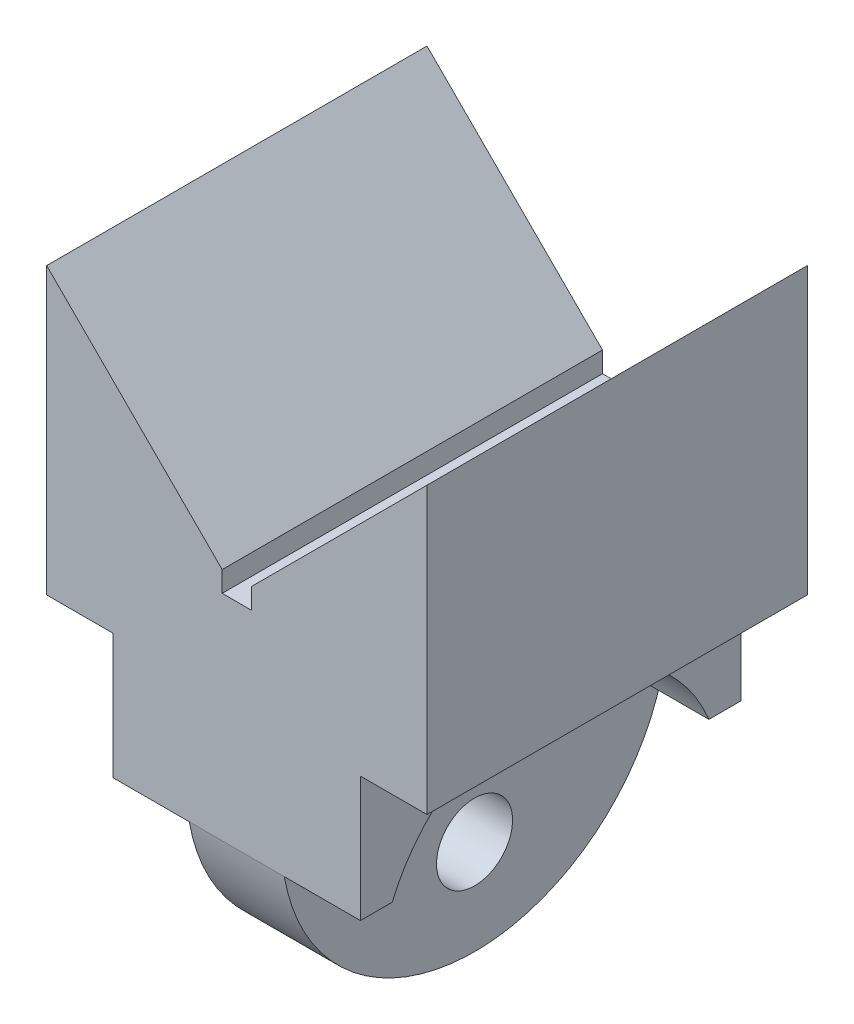
ISO-10303-21;
HEADER;
FILE_DESCRIPTION(('STEP AP214'),'2;1');
FILE_NAME('part.step','',(''),(''),'','','');
FILE_SCHEMA(('AUTOMOTIVE_DESIGN { 1 0 10303 214 1 1 1 1 }'));
ENDSEC;
DATA;
#1=APPLICATION_CONTEXT('core data for automotive mechanical design processes');
#2=APPLICATION_PROTOCOL_DEFINITION('international standard','automotive_design',2000,#1);
#3=PRODUCT_CONTEXT('',#1,'mechanical');
#4=PRODUCT('Part','Part','',(#3));
#5=PRODUCT_RELATED_PRODUCT_CATEGORY('part','',(#4));
#6=PRODUCT_DEFINITION_FORMATION('','',#4);
#7=PRODUCT_DEFINITION_CONTEXT('part definition',#1,'design');
#8=PRODUCT_DEFINITION('design','',#6,#7);
#9=PRODUCT_DEFINITION_SHAPE('','',#8);
#10=(LENGTH_UNIT() NAMED_UNIT(*) SI_UNIT(.MILLI.,.METRE.));
#11=(NAMED_UNIT(*) PLANE_ANGLE_UNIT() SI_UNIT($,.RADIAN.));
#12=(NAMED_UNIT(*) SI_UNIT($,.STERADIAN.) SOLID_ANGLE_UNIT());
#13=UNCERTAINTY_MEASURE_WITH_UNIT(LENGTH_MEASURE(1.E-05),#10,'distance_accuracy_value','');
#14=(GEOMETRIC_REPRESENTATION_CONTEXT(3) GLOBAL_UNCERTAINTY_ASSIGNED_CONTEXT((#13)) GLOBAL_UNIT_ASSIGNED_CONTEXT((#10,
#11,#12)) REPRESENTATION_CONTEXT('',''));
#15=CARTESIAN_POINT('',(0.,0.,0.));
#16=DIRECTION('',(0.,0.,1.));
#17=DIRECTION('',(1.,0.,0.));
#18=AXIS2_PLACEMENT_3D('',#15,#16,#17);
#19=CARTESIAN_POINT('',(2.5,0.,20.));
#20=DIRECTION('',(-1.,0.,0.));
#21=DIRECTION('',(0.,0.,1.));
#22=AXIS2_PLACEMENT_3D('',#19,#20,#21);
#23=PLANE('',#22);
#24=CARTESIAN_POINT('',(2.5,5.,10.));
#25=DIRECTION('',(-1.,0.,0.));
#26=DIRECTION('',(0.,0.,1.));
#27=AXIS2_PLACEMENT_3D('',#24,#25,#26);
#28=CIRCLE('',#27,2.);
#29=CARTESIAN_POINT('',(2.5,5.,12.));
#30=VERTEX_POINT('',#29);
#31=EDGE_CURVE('E55',#30,#30,#28,.T.);
#32=ORIENTED_EDGE('',*,*,#31,.T.);
#33=EDGE_LOOP('',(#32));
#34=FACE_BOUND('',#33,.T.);
#35=DIRECTION('',(0.,0.,1.));
#36=VECTOR('',#35,1.);
#37=CARTESIAN_POINT('',(2.5,8.42048243587993,18.3246801683811));
#38=LINE('',#37,#36);
#39=CARTESIAN_POINT('',(2.5,8.42048243587993,18.3246801683811));
#40=VERTEX_POINT('',#39);
#41=CARTESIAN_POINT('',(2.5,8.42048243587993,20.));
#42=VERTEX_POINT('',#41);
#43=EDGE_CURVE('E333',#40,#42,#38,.T.);
#44=ORIENTED_EDGE('',*,*,#43,.T.);
#45=CARTESIAN_POINT('',(2.5,10.1481432776781,10.));
#46=DIRECTION('',(-1.,0.,0.));
#47=DIRECTION('',(0.,0.,1.));
#48=AXIS2_PLACEMENT_3D('',#45,#46,#47);
#49=CIRCLE('',#48,10.1481432776781);
#50=CARTESIAN_POINT('',(2.5,8.42048243587993,0.));
#51=VERTEX_POINT('',#50);
#52=EDGE_CURVE('E193',#51,#42,#49,.T.);
#53=ORIENTED_EDGE('',*,*,#52,.F.);
#54=DIRECTION('',(0.,0.,1.));
#55=VECTOR('',#54,1.);
#56=CARTESIAN_POINT('',(2.5,8.42048243587993,0.));
#57=LINE('',#56,#55);
#58=CARTESIAN_POINT('',(2.5,8.42048243587993,1.67531983161894));
#59=VERTEX_POINT('',#58);
#60=EDGE_CURVE('E72',#51,#59,#57,.T.);
#61=ORIENTED_EDGE('',*,*,#60,.T.);
#62=CARTESIAN_POINT('',(2.5,5.,10.));
#63=DIRECTION('',(1.,0.,0.));
#64=DIRECTION('',(0.,1.,0.));
#65=AXIS2_PLACEMENT_3D('',#62,#63,#64);
#66=CIRCLE('',#65,9.);
#67=EDGE_CURVE('E67',#59,#40,#66,.T.);
#68=ORIENTED_EDGE('',*,*,#67,.T.);
#69=EDGE_LOOP('',(#44,#53,#61,#68));
#70=FACE_BOUND('',#69,.T.);
#71=ADVANCED_FACE('F51',(#34,#70),#23,.F.);
#72=CARTESIAN_POINT('',(-2.5,0.,20.));
#73=DIRECTION('',(1.,0.,0.));
#74=DIRECTION('',(0.,0.,-1.));
#75=AXIS2_PLACEMENT_3D('',#72,#73,#74);
#76=PLANE('',#75);
#77=CARTESIAN_POINT('',(-2.5,5.,10.));
#78=DIRECTION('',(-1.,0.,0.));
#79=DIRECTION('',(0.,0.,1.));
#80=AXIS2_PLACEMENT_3D('',#77,#78,#79);
#81=CIRCLE('',#80,2.);
#82=CARTESIAN_POINT('',(-2.5,5.,12.));
#83=VERTEX_POINT('',#82);
#84=EDGE_CURVE('E222',#83,#83,#81,.T.);
#85=ORIENTED_EDGE('',*,*,#84,.F.);
#86=EDGE_LOOP('',(#85));
#87=FACE_BOUND('',#86,.T.);
#88=CARTESIAN_POINT('',(-2.5,10.1481432776781,10.));
#89=DIRECTION('',(-1.,0.,0.));
#90=DIRECTION('',(0.,0.,1.));
#91=AXIS2_PLACEMENT_3D('',#88,#89,#90);
#92=CIRCLE('',#91,10.1481432776781);
#93=CARTESIAN_POINT('',(-2.5,8.42048243587993,0.));
#94=VERTEX_POINT('',#93);
#95=CARTESIAN_POINT('',(-2.5,8.42048243587993,20.));
#96=VERTEX_POINT('',#95);
#97=EDGE_CURVE('E177',#94,#96,#92,.T.);
#98=ORIENTED_EDGE('',*,*,#97,.T.);
#99=DIRECTION('',(0.,0.,1.));
#100=VECTOR('',#99,1.);
#101=CARTESIAN_POINT('',(-2.5,8.42048243587993,18.3246801683811));
#102=LINE('',#101,#100);
#103=CARTESIAN_POINT('',(-2.5,8.42048243587993,18.3246801683811));
#104=VERTEX_POINT('',#103);
#105=EDGE_CURVE('E181',#104,#96,#102,.T.);
#106=ORIENTED_EDGE('',*,*,#105,.F.);
#107=CARTESIAN_POINT('',(-2.5,5.,10.));
#108=DIRECTION('',(1.,0.,0.));
#109=DIRECTION('',(0.,1.,0.));
#110=AXIS2_PLACEMENT_3D('',#107,#108,#109);
#111=CIRCLE('',#110,9.);
#112=CARTESIAN_POINT('',(-2.5,8.42048243587993,1.67531983161894));
#113=VERTEX_POINT('',#112);
#114=EDGE_CURVE('E207',#113,#104,#111,.T.);
#115=ORIENTED_EDGE('',*,*,#114,.F.);
#116=DIRECTION('',(0.,0.,1.));
#117=VECTOR('',#116,1.);
#118=CARTESIAN_POINT('',(-2.5,8.42048243587993,0.));
#119=LINE('',#118,#117);
#120=EDGE_CURVE('E184',#94,#113,#119,.T.);
#121=ORIENTED_EDGE('',*,*,#120,.F.);
#122=EDGE_LOOP('',(#98,#106,#115,#121));
#123=FACE_BOUND('',#122,.T.);
#124=ADVANCED_FACE('F179',(#87,#123),#76,.F.);
#125=CARTESIAN_POINT('',(0.,0.,20.));
#126=DIRECTION('',(0.,0.,-1.));
#127=DIRECTION('',(-1.,0.,0.));
#128=AXIS2_PLACEMENT_3D('',#125,#126,#127);
#129=PLANE('',#128);
#130=DIRECTION('',(-1.,0.,0.));
#131=VECTOR('',#130,1.);
#132=CARTESIAN_POINT('',(10.,8.42048243587993,20.));
#133=LINE('',#132,#131);
#134=EDGE_CURVE('E189',#42,#96,#133,.T.);
#135=ORIENTED_EDGE('',*,*,#134,.F.);
#136=DIRECTION('',(-1.,0.,0.));
#137=VECTOR('',#136,1.);
#138=CARTESIAN_POINT('',(6.50000000000001,8.42048243587993,20.));
#139=LINE('',#138,#137);
#140=CARTESIAN_POINT('',(6.50000000000001,8.42048243587993,20.));
#141=VERTEX_POINT('',#140);
#142=EDGE_CURVE('E339',#141,#42,#139,.T.);
#143=ORIENTED_EDGE('',*,*,#142,.F.);
#144=DIRECTION('',(0.,1.,0.));
#145=VECTOR('',#144,1.);
#146=CARTESIAN_POINT('',(6.50000000000001,15.,20.));
#147=LINE('',#146,#145);
#148=CARTESIAN_POINT('',(6.50000000000001,15.,20.));
#149=VERTEX_POINT('',#148);
#150=EDGE_CURVE('E310',#141,#149,#147,.T.);
#151=ORIENTED_EDGE('',*,*,#150,.T.);
#152=DIRECTION('',(1.,0.,0.));
#153=VECTOR('',#152,1.);
#154=CARTESIAN_POINT('',(2.5,15.,20.));
#155=LINE('',#154,#153);
#156=CARTESIAN_POINT('',(10.,15.,20.));
#157=VERTEX_POINT('',#156);
#158=EDGE_CURVE('E231',#149,#157,#155,.T.);
#159=ORIENTED_EDGE('',*,*,#158,.T.);
#160=DIRECTION('',(0.,1.,0.));
#161=VECTOR('',#160,1.);
#162=CARTESIAN_POINT('',(10.,15.,20.));
#163=LINE('',#162,#161);
#164=CARTESIAN_POINT('',(10.,30.,20.));
#165=VERTEX_POINT('',#164);
#166=EDGE_CURVE('E233',#157,#165,#163,.T.);
#167=ORIENTED_EDGE('',*,*,#166,.T.);
#168=DIRECTION('',(-0.707106781186544,-0.707106781186551,0.));
#169=VECTOR('',#168,1.);
#170=CARTESIAN_POINT('',(10.,30.,20.));
#171=LINE('',#170,#169);
#172=CARTESIAN_POINT('',(0.771012727126321,20.7710127271262,20.));
#173=VERTEX_POINT('',#172);
#174=EDGE_CURVE('E235',#165,#173,#171,.T.);
#175=ORIENTED_EDGE('',*,*,#174,.T.);
#176=DIRECTION('',(0.,-1.,0.));
#177=VECTOR('',#176,1.);
#178=CARTESIAN_POINT('',(0.771012727126321,20.7710127271262,20.));
#179=LINE('',#178,#177);
#180=CARTESIAN_POINT('',(0.771012727126321,19.6881761290014,20.));
#181=VERTEX_POINT('',#180);
#182=EDGE_CURVE('E237',#173,#181,#179,.T.);
#183=ORIENTED_EDGE('',*,*,#182,.T.);
#184=DIRECTION('',(-1.,0.,0.));
#185=VECTOR('',#184,1.);
#186=CARTESIAN_POINT('',(-0.771012727126321,19.6881761290014,20.));
#187=LINE('',#186,#185);
#188=CARTESIAN_POINT('',(-0.771012727126321,19.6881761290014,20.));
#189=VERTEX_POINT('',#188);
#190=EDGE_CURVE('E239',#181,#189,#187,.T.);
#191=ORIENTED_EDGE('',*,*,#190,.T.);
#192=DIRECTION('',(0.,1.,0.));
#193=VECTOR('',#192,1.);
#194=CARTESIAN_POINT('',(-0.771012727126317,20.7710127271262,20.));
#195=LINE('',#194,#193);
#196=CARTESIAN_POINT('',(-0.771012727126317,20.7710127271262,20.));
#197=VERTEX_POINT('',#196);
#198=EDGE_CURVE('E241',#189,#197,#195,.T.);
#199=ORIENTED_EDGE('',*,*,#198,.T.);
#200=DIRECTION('',(-0.707106781186544,0.707106781186551,0.));
#201=VECTOR('',#200,1.);
#202=CARTESIAN_POINT('',(-10.,30.,20.));
#203=LINE('',#202,#201);
#204=CARTESIAN_POINT('',(-10.,30.,20.));
#205=VERTEX_POINT('',#204);
#206=EDGE_CURVE('E243',#197,#205,#203,.T.);
#207=ORIENTED_EDGE('',*,*,#206,.T.);
#208=DIRECTION('',(0.,-1.,0.));
#209=VECTOR('',#208,1.);
#210=CARTESIAN_POINT('',(-10.,15.,20.));
#211=LINE('',#210,#209);
#212=CARTESIAN_POINT('',(-10.,15.,20.));
#213=VERTEX_POINT('',#212);
#214=EDGE_CURVE('E225',#205,#213,#211,.T.);
#215=ORIENTED_EDGE('',*,*,#214,.T.);
#216=DIRECTION('',(1.,0.,0.));
#217=VECTOR('',#216,1.);
#218=CARTESIAN_POINT('',(-2.5,15.,20.));
#219=LINE('',#218,#217);
#220=CARTESIAN_POINT('',(-6.50000000000001,15.,20.));
#221=VERTEX_POINT('',#220);
#222=EDGE_CURVE('E228',#213,#221,#219,.T.);
#223=ORIENTED_EDGE('',*,*,#222,.T.);
#224=DIRECTION('',(0.,1.,0.));
#225=VECTOR('',#224,1.);
#226=CARTESIAN_POINT('',(-6.50000000000001,15.,20.));
#227=LINE('',#226,#225);
#228=CARTESIAN_POINT('',(-6.50000000000001,8.42048243587993,20.));
#229=VERTEX_POINT('',#228);
#230=EDGE_CURVE('E212',#229,#221,#227,.T.);
#231=ORIENTED_EDGE('',*,*,#230,.F.);
#232=DIRECTION('',(1.,0.,0.));
#233=VECTOR('',#232,1.);
#234=CARTESIAN_POINT('',(-6.50000000000001,8.42048243587993,20.));
#235=LINE('',#234,#233);
#236=EDGE_CURVE('E202',#229,#96,#235,.T.);
#237=ORIENTED_EDGE('',*,*,#236,.T.);
#238=EDGE_LOOP('',(#135,#143,#151,#159,#167,#175,#183,#191,#199,#207,#215,#223,#231,#237));
#239=FACE_BOUND('',#238,.T.);
#240=ADVANCED_FACE('F209',(#239),#129,.F.);
#241=CARTESIAN_POINT('',(0.,0.,0.));
#242=DIRECTION('',(0.,0.,-1.));
#243=DIRECTION('',(-1.,0.,0.));
#244=AXIS2_PLACEMENT_3D('',#241,#242,#243);
#245=PLANE('',#244);
#246=DIRECTION('',(-1.,0.,0.));
#247=VECTOR('',#246,1.);
#248=CARTESIAN_POINT('',(6.50000000000001,8.42048243587993,0.));
#249=LINE('',#248,#247);
#250=CARTESIAN_POINT('',(6.50000000000001,8.42048243587993,0.));
#251=VERTEX_POINT('',#250);
#252=EDGE_CURVE('E342',#251,#51,#249,.T.);
#253=ORIENTED_EDGE('',*,*,#252,.T.);
#254=DIRECTION('',(-1.,0.,0.));
#255=VECTOR('',#254,1.);
#256=CARTESIAN_POINT('',(10.,8.42048243587993,0.));
#257=LINE('',#256,#255);
#258=EDGE_CURVE('E188',#51,#94,#257,.T.);
#259=ORIENTED_EDGE('',*,*,#258,.T.);
#260=DIRECTION('',(1.,0.,0.));
#261=VECTOR('',#260,1.);
#262=CARTESIAN_POINT('',(-6.50000000000001,8.42048243587993,0.));
#263=LINE('',#262,#261);
#264=CARTESIAN_POINT('',(-6.50000000000001,8.42048243587993,0.));
#265=VERTEX_POINT('',#264);
#266=EDGE_CURVE('E213',#265,#94,#263,.T.);
#267=ORIENTED_EDGE('',*,*,#266,.F.);
#268=DIRECTION('',(0.,-1.,0.));
#269=VECTOR('',#268,1.);
#270=CARTESIAN_POINT('',(-6.50000000000001,8.42048243587993,0.));
#271=LINE('',#270,#269);
#272=CARTESIAN_POINT('',(-6.50000000000001,15.,0.));
#273=VERTEX_POINT('',#272);
#274=EDGE_CURVE('E217',#273,#265,#271,.T.);
#275=ORIENTED_EDGE('',*,*,#274,.F.);
#276=DIRECTION('',(1.,0.,0.));
#277=VECTOR('',#276,1.);
#278=CARTESIAN_POINT('',(-2.5,15.,0.));
#279=LINE('',#278,#277);
#280=CARTESIAN_POINT('',(-10.,15.,0.));
#281=VERTEX_POINT('',#280);
#282=EDGE_CURVE('E249',#281,#273,#279,.T.);
#283=ORIENTED_EDGE('',*,*,#282,.F.);
#284=DIRECTION('',(0.,-1.,0.));
#285=VECTOR('',#284,1.);
#286=CARTESIAN_POINT('',(-10.,15.,0.));
#287=LINE('',#286,#285);
#288=CARTESIAN_POINT('',(-10.,30.,0.));
#289=VERTEX_POINT('',#288);
#290=EDGE_CURVE('E246',#289,#281,#287,.T.);
#291=ORIENTED_EDGE('',*,*,#290,.F.);
#292=DIRECTION('',(-0.707106781186544,0.707106781186551,0.));
#293=VECTOR('',#292,1.);
#294=CARTESIAN_POINT('',(-10.,30.,0.));
#295=LINE('',#294,#293);
#296=CARTESIAN_POINT('',(-0.771012727126317,20.7710127271262,0.));
#297=VERTEX_POINT('',#296);
#298=EDGE_CURVE('E229',#297,#289,#295,.T.);
#299=ORIENTED_EDGE('',*,*,#298,.F.);
#300=DIRECTION('',(0.,1.,0.));
#301=VECTOR('',#300,1.);
#302=CARTESIAN_POINT('',(-0.771012727126317,20.7710127271262,0.));
#303=LINE('',#302,#301);
#304=CARTESIAN_POINT('',(-0.771012727126321,19.6881761290014,0.));
#305=VERTEX_POINT('',#304);
#306=EDGE_CURVE('E261',#305,#297,#303,.T.);
#307=ORIENTED_EDGE('',*,*,#306,.F.);
#308=DIRECTION('',(-1.,0.,0.));
#309=VECTOR('',#308,1.);
#310=CARTESIAN_POINT('',(-0.771012727126321,19.6881761290014,0.));
#311=LINE('',#310,#309);
#312=CARTESIAN_POINT('',(0.771012727126321,19.6881761290014,0.));
#313=VERTEX_POINT('',#312);
#314=EDGE_CURVE('E259',#313,#305,#311,.T.);
#315=ORIENTED_EDGE('',*,*,#314,.F.);
#316=DIRECTION('',(0.,-1.,0.));
#317=VECTOR('',#316,1.);
#318=CARTESIAN_POINT('',(0.771012727126321,20.7710127271262,0.));
#319=LINE('',#318,#317);
#320=CARTESIAN_POINT('',(0.771012727126321,20.7710127271262,0.));
#321=VERTEX_POINT('',#320);
#322=EDGE_CURVE('E257',#321,#313,#319,.T.);
#323=ORIENTED_EDGE('',*,*,#322,.F.);
#324=DIRECTION('',(-0.707106781186544,-0.707106781186551,0.));
#325=VECTOR('',#324,1.);
#326=CARTESIAN_POINT('',(10.,30.,0.));
#327=LINE('',#326,#325);
#328=CARTESIAN_POINT('',(10.,30.,0.));
#329=VERTEX_POINT('',#328);
#330=EDGE_CURVE('E255',#329,#321,#327,.T.);
#331=ORIENTED_EDGE('',*,*,#330,.F.);
#332=DIRECTION('',(0.,1.,0.));
#333=VECTOR('',#332,1.);
#334=CARTESIAN_POINT('',(10.,15.,0.));
#335=LINE('',#334,#333);
#336=CARTESIAN_POINT('',(10.,15.,0.));
#337=VERTEX_POINT('',#336);
#338=EDGE_CURVE('E253',#337,#329,#335,.T.);
#339=ORIENTED_EDGE('',*,*,#338,.F.);
#340=DIRECTION('',(1.,0.,0.));
#341=VECTOR('',#340,1.);
#342=CARTESIAN_POINT('',(2.5,15.,0.));
#343=LINE('',#342,#341);
#344=CARTESIAN_POINT('',(6.50000000000001,15.,0.));
#345=VERTEX_POINT('',#344);
#346=EDGE_CURVE('E251',#345,#337,#343,.T.);
#347=ORIENTED_EDGE('',*,*,#346,.F.);
#348=DIRECTION('',(0.,-1.,0.));
#349=VECTOR('',#348,1.);
#350=CARTESIAN_POINT('',(6.50000000000001,8.42048243587993,0.));
#351=LINE('',#350,#349);
#352=EDGE_CURVE('E319',#345,#251,#351,.T.);
#353=ORIENTED_EDGE('',*,*,#352,.T.);
#354=EDGE_LOOP('',(#253,#259,#267,#275,#283,#291,#299,#307,#315,#323,#331,#339,#347,#353));
#355=FACE_BOUND('',#354,.T.);
#356=ADVANCED_FACE('F293',(#355),#245,.T.);
#357=CARTESIAN_POINT('',(2.5,15.,20.));
#358=DIRECTION('',(0.,1.,0.));
#359=DIRECTION('',(-1.,0.,0.));
#360=AXIS2_PLACEMENT_3D('',#357,#358,#359);
#361=PLANE('',#360);
#362=DIRECTION('',(0.,0.,-1.));
#363=VECTOR('',#362,1.);
#364=CARTESIAN_POINT('',(6.50000000000001,15.,0.));
#365=LINE('',#364,#363);
#366=EDGE_CURVE('E313',#149,#345,#365,.T.);
#367=ORIENTED_EDGE('',*,*,#366,.T.);
#368=ORIENTED_EDGE('',*,*,#346,.T.);
#369=DIRECTION('',(0.,0.,-1.));
#370=VECTOR('',#369,1.);
#371=CARTESIAN_POINT('',(10.,15.,20.));
#372=LINE('',#371,#370);
#373=EDGE_CURVE('E60',#157,#337,#372,.T.);
#374=ORIENTED_EDGE('',*,*,#373,.F.);
#375=ORIENTED_EDGE('',*,*,#158,.F.);
#376=EDGE_LOOP('',(#367,#368,#374,#375));
#377=FACE_BOUND('',#376,.T.);
#378=ADVANCED_FACE('F312',(#377),#361,.F.);
#379=CARTESIAN_POINT('',(-2.5,15.,20.));
#380=DIRECTION('',(0.,1.,0.));
#381=DIRECTION('',(-1.,0.,0.));
#382=AXIS2_PLACEMENT_3D('',#379,#380,#381);
#383=PLANE('',#382);
#384=DIRECTION('',(0.,0.,-1.));
#385=VECTOR('',#384,1.);
#386=CARTESIAN_POINT('',(-6.50000000000001,15.,0.));
#387=LINE('',#386,#385);
#388=EDGE_CURVE('E351',#221,#273,#387,.T.);
#389=ORIENTED_EDGE('',*,*,#388,.F.);
#390=ORIENTED_EDGE('',*,*,#222,.F.);
#391=DIRECTION('',(0.,0.,-1.));
#392=VECTOR('',#391,1.);
#393=CARTESIAN_POINT('',(-10.,15.,20.));
#394=LINE('',#393,#392);
#395=EDGE_CURVE('E12',#213,#281,#394,.T.);
#396=ORIENTED_EDGE('',*,*,#395,.T.);
#397=ORIENTED_EDGE('',*,*,#282,.T.);
#398=EDGE_LOOP('',(#389,#390,#396,#397));
#399=FACE_BOUND('',#398,.T.);
#400=ADVANCED_FACE('F386',(#399),#383,.F.);
#401=CARTESIAN_POINT('',(-10.,15.,20.));
#402=DIRECTION('',(1.,0.,0.));
#403=DIRECTION('',(0.,0.,-1.));
#404=AXIS2_PLACEMENT_3D('',#401,#402,#403);
#405=PLANE('',#404);
#406=ORIENTED_EDGE('',*,*,#290,.T.);
#407=ORIENTED_EDGE('',*,*,#395,.F.);
#408=ORIENTED_EDGE('',*,*,#214,.F.);
#409=DIRECTION('',(0.,0.,-1.));
#410=VECTOR('',#409,1.);
#411=CARTESIAN_POINT('',(-10.,30.,20.));
#412=LINE('',#411,#410);
#413=EDGE_CURVE('E245',#205,#289,#412,.T.);
#414=ORIENTED_EDGE('',*,*,#413,.T.);
#415=EDGE_LOOP('',(#406,#407,#408,#414));
#416=FACE_BOUND('',#415,.T.);
#417=ADVANCED_FACE('F53',(#416),#405,.F.);
#418=CARTESIAN_POINT('',(10.,15.,20.));
#419=DIRECTION('',(-1.,0.,0.));
#420=DIRECTION('',(0.,0.,1.));
#421=AXIS2_PLACEMENT_3D('',#418,#419,#420);
#422=PLANE('',#421);
#423=ORIENTED_EDGE('',*,*,#338,.T.);
#424=DIRECTION('',(0.,0.,-1.));
#425=VECTOR('',#424,1.);
#426=CARTESIAN_POINT('',(10.,30.,20.));
#427=LINE('',#426,#425);
#428=EDGE_CURVE('E278',#165,#329,#427,.T.);
#429=ORIENTED_EDGE('',*,*,#428,.F.);
#430=ORIENTED_EDGE('',*,*,#166,.F.);
#431=ORIENTED_EDGE('',*,*,#373,.T.);
#432=EDGE_LOOP('',(#423,#429,#430,#431));
#433=FACE_BOUND('',#432,.T.);
#434=ADVANCED_FACE('F286',(#433),#422,.F.);
#435=CARTESIAN_POINT('',(10.,30.,20.));
#436=DIRECTION('',(0.707106781186551,-0.707106781186544,0.));
#437=DIRECTION('',(0.707106781186544,0.707106781186551,0.));
#438=AXIS2_PLACEMENT_3D('',#435,#436,#437);
#439=PLANE('',#438);
#440=ORIENTED_EDGE('',*,*,#330,.T.);
#441=DIRECTION('',(0.,0.,-1.));
#442=VECTOR('',#441,1.);
#443=CARTESIAN_POINT('',(0.771012727126321,20.7710127271262,20.));
#444=LINE('',#443,#442);
#445=EDGE_CURVE('E275',#173,#321,#444,.T.);
#446=ORIENTED_EDGE('',*,*,#445,.F.);
#447=ORIENTED_EDGE('',*,*,#174,.F.);
#448=ORIENTED_EDGE('',*,*,#428,.T.);
#449=EDGE_LOOP('',(#440,#446,#447,#448));
#450=FACE_BOUND('',#449,.T.);
#451=ADVANCED_FACE('F300',(#450),#439,.F.);
#452=CARTESIAN_POINT('',(0.771012727126321,20.7710127271262,20.));
#453=DIRECTION('',(1.,0.,0.));
#454=DIRECTION('',(0.,1.,0.));
#455=AXIS2_PLACEMENT_3D('',#452,#453,#454);
#456=PLANE('',#455);
#457=ORIENTED_EDGE('',*,*,#322,.T.);
#458=DIRECTION('',(0.,0.,-1.));
#459=VECTOR('',#458,1.);
#460=CARTESIAN_POINT('',(0.771012727126321,19.6881761290014,20.));
#461=LINE('',#460,#459);
#462=EDGE_CURVE('E272',#181,#313,#461,.T.);
#463=ORIENTED_EDGE('',*,*,#462,.F.);
#464=ORIENTED_EDGE('',*,*,#182,.F.);
#465=ORIENTED_EDGE('',*,*,#445,.T.);
#466=EDGE_LOOP('',(#457,#463,#464,#465));
#467=FACE_BOUND('',#466,.T.);
#468=ADVANCED_FACE('F304',(#467),#456,.F.);
#469=CARTESIAN_POINT('',(-0.771012727126321,19.6881761290014,20.));
#470=DIRECTION('',(0.,-1.,0.));
#471=DIRECTION('',(0.,0.,-1.));
#472=AXIS2_PLACEMENT_3D('',#469,#470,#471);
#473=PLANE('',#472);
#474=ORIENTED_EDGE('',*,*,#314,.T.);
#475=DIRECTION('',(0.,0.,-1.));
#476=VECTOR('',#475,1.);
#477=CARTESIAN_POINT('',(-0.771012727126321,19.6881761290014,20.));
#478=LINE('',#477,#476);
#479=EDGE_CURVE('E269',#189,#305,#478,.T.);
#480=ORIENTED_EDGE('',*,*,#479,.F.);
#481=ORIENTED_EDGE('',*,*,#190,.F.);
#482=ORIENTED_EDGE('',*,*,#462,.T.);
#483=EDGE_LOOP('',(#474,#480,#481,#482));
#484=FACE_BOUND('',#483,.T.);
#485=ADVANCED_FACE('F427',(#484),#473,.F.);
#486=CARTESIAN_POINT('',(-0.771012727126317,20.7710127271262,20.));
#487=DIRECTION('',(-1.,0.,0.));
#488=DIRECTION('',(0.,-1.,0.));
#489=AXIS2_PLACEMENT_3D('',#486,#487,#488);
#490=PLANE('',#489);
#491=ORIENTED_EDGE('',*,*,#306,.T.);
#492=DIRECTION('',(0.,0.,-1.));
#493=VECTOR('',#492,1.);
#494=CARTESIAN_POINT('',(-0.771012727126317,20.7710127271262,20.));
#495=LINE('',#494,#493);
#496=EDGE_CURVE('E266',#197,#297,#495,.T.);
#497=ORIENTED_EDGE('',*,*,#496,.F.);
#498=ORIENTED_EDGE('',*,*,#198,.F.);
#499=ORIENTED_EDGE('',*,*,#479,.T.);
#500=EDGE_LOOP('',(#491,#497,#498,#499));
#501=FACE_BOUND('',#500,.T.);
#502=ADVANCED_FACE('F423',(#501),#490,.F.);
#503=CARTESIAN_POINT('',(-10.,30.,20.));
#504=DIRECTION('',(-0.707106781186551,-0.707106781186544,0.));
#505=DIRECTION('',(0.707106781186544,-0.707106781186551,0.));
#506=AXIS2_PLACEMENT_3D('',#503,#504,#505);
#507=PLANE('',#506);
#508=ORIENTED_EDGE('',*,*,#298,.T.);
#509=ORIENTED_EDGE('',*,*,#413,.F.);
#510=ORIENTED_EDGE('',*,*,#206,.F.);
#511=ORIENTED_EDGE('',*,*,#496,.T.);
#512=EDGE_LOOP('',(#508,#509,#510,#511));
#513=FACE_BOUND('',#512,.T.);
#514=ADVANCED_FACE('F415',(#513),#507,.F.);
#515=CARTESIAN_POINT('',(10.,5.,10.));
#516=DIRECTION('',(-1.,0.,0.));
#517=DIRECTION('',(0.,0.,1.));
#518=AXIS2_PLACEMENT_3D('',#515,#516,#517);
#519=CYLINDRICAL_SURFACE('',#518,2.);
#520=ORIENTED_EDGE('',*,*,#84,.T.);
#521=EDGE_LOOP('',(#520));
#522=FACE_BOUND('',#521,.T.);
#523=ORIENTED_EDGE('',*,*,#31,.F.);
#524=EDGE_LOOP('',(#523));
#525=FACE_BOUND('',#524,.T.);
#526=ADVANCED_FACE('F412',(#522,#525),#519,.F.);
#527=CARTESIAN_POINT('',(-6.50000000000001,8.42048243587993,0.));
#528=DIRECTION('',(0.,1.,0.));
#529=DIRECTION('',(-1.,0.,0.));
#530=AXIS2_PLACEMENT_3D('',#527,#528,#529);
#531=PLANE('',#530);
#532=ORIENTED_EDGE('',*,*,#120,.T.);
#533=DIRECTION('',(1.,0.,0.));
#534=VECTOR('',#533,1.);
#535=CARTESIAN_POINT('',(-6.50000000000001,8.42048243587993,1.67531983161894));
#536=LINE('',#535,#534);
#537=CARTESIAN_POINT('',(-6.50000000000001,8.42048243587993,1.67531983161894));
#538=VERTEX_POINT('',#537);
#539=EDGE_CURVE('E215',#538,#113,#536,.T.);
#540=ORIENTED_EDGE('',*,*,#539,.F.);
#541=DIRECTION('',(0.,0.,1.));
#542=VECTOR('',#541,1.);
#543=CARTESIAN_POINT('',(-6.50000000000001,8.42048243587993,0.));
#544=LINE('',#543,#542);
#545=EDGE_CURVE('E206',#265,#538,#544,.T.);
#546=ORIENTED_EDGE('',*,*,#545,.F.);
#547=ORIENTED_EDGE('',*,*,#266,.T.);
#548=EDGE_LOOP('',(#532,#540,#546,#547));
#549=FACE_BOUND('',#548,.T.);
#550=ADVANCED_FACE('F361',(#549),#531,.F.);
#551=CARTESIAN_POINT('',(-6.50000000000001,5.,10.));
#552=DIRECTION('',(1.,0.,0.));
#553=DIRECTION('',(0.,1.,0.));
#554=AXIS2_PLACEMENT_3D('',#551,#552,#553);
#555=CYLINDRICAL_SURFACE('',#554,9.);
#556=ORIENTED_EDGE('',*,*,#114,.T.);
#557=DIRECTION('',(1.,0.,0.));
#558=VECTOR('',#557,1.);
#559=CARTESIAN_POINT('',(-6.50000000000001,8.42048243587993,18.3246801683811));
#560=LINE('',#559,#558);
#561=CARTESIAN_POINT('',(-6.50000000000001,8.42048243587993,18.3246801683811));
#562=VERTEX_POINT('',#561);
#563=EDGE_CURVE('E205',#562,#104,#560,.T.);
#564=ORIENTED_EDGE('',*,*,#563,.F.);
#565=CARTESIAN_POINT('',(-6.50000000000001,5.,10.));
#566=DIRECTION('',(1.,0.,0.));
#567=DIRECTION('',(0.,1.,0.));
#568=AXIS2_PLACEMENT_3D('',#565,#566,#567);
#569=CIRCLE('',#568,9.);
#570=EDGE_CURVE('E346',#538,#562,#569,.T.);
#571=ORIENTED_EDGE('',*,*,#570,.F.);
#572=ORIENTED_EDGE('',*,*,#539,.T.);
#573=EDGE_LOOP('',(#556,#564,#571,#572));
#574=FACE_BOUND('',#573,.T.);
#575=ADVANCED_FACE('F357',(#574),#555,.F.);
#576=CARTESIAN_POINT('',(-6.50000000000001,8.42048243587993,18.3246801683811));
#577=DIRECTION('',(0.,1.,0.));
#578=DIRECTION('',(-1.,0.,0.));
#579=AXIS2_PLACEMENT_3D('',#576,#577,#578);
#580=PLANE('',#579);
#581=ORIENTED_EDGE('',*,*,#105,.T.);
#582=ORIENTED_EDGE('',*,*,#236,.F.);
#583=DIRECTION('',(0.,0.,1.));
#584=VECTOR('',#583,1.);
#585=CARTESIAN_POINT('',(-6.50000000000001,8.42048243587993,18.3246801683811));
#586=LINE('',#585,#584);
#587=EDGE_CURVE('E348',#562,#229,#586,.T.);
#588=ORIENTED_EDGE('',*,*,#587,.F.);
#589=ORIENTED_EDGE('',*,*,#563,.T.);
#590=EDGE_LOOP('',(#581,#582,#588,#589));
#591=FACE_BOUND('',#590,.T.);
#592=ADVANCED_FACE('F200',(#591),#580,.F.);
#593=CARTESIAN_POINT('',(-6.50000000000001,5.,10.));
#594=DIRECTION('',(1.,0.,0.));
#595=DIRECTION('',(0.,1.,0.));
#596=AXIS2_PLACEMENT_3D('',#593,#594,#595);
#597=PLANE('',#596);
#598=ORIENTED_EDGE('',*,*,#545,.T.);
#599=ORIENTED_EDGE('',*,*,#570,.T.);
#600=ORIENTED_EDGE('',*,*,#587,.T.);
#601=ORIENTED_EDGE('',*,*,#230,.T.);
#602=ORIENTED_EDGE('',*,*,#388,.T.);
#603=ORIENTED_EDGE('',*,*,#274,.T.);
#604=EDGE_LOOP('',(#598,#599,#600,#601,#602,#603));
#605=FACE_BOUND('',#604,.T.);
#606=ADVANCED_FACE('F397',(#605),#597,.F.);
#607=CARTESIAN_POINT('',(6.50000000000001,8.42048243587993,0.));
#608=DIRECTION('',(0.,-1.,0.));
#609=DIRECTION('',(1.,0.,0.));
#610=AXIS2_PLACEMENT_3D('',#607,#608,#609);
#611=PLANE('',#610);
#612=ORIENTED_EDGE('',*,*,#60,.F.);
#613=ORIENTED_EDGE('',*,*,#252,.F.);
#614=DIRECTION('',(0.,0.,1.));
#615=VECTOR('',#614,1.);
#616=CARTESIAN_POINT('',(6.50000000000001,8.42048243587993,0.));
#617=LINE('',#616,#615);
#618=CARTESIAN_POINT('',(6.50000000000001,8.42048243587993,1.67531983161894));
#619=VERTEX_POINT('',#618);
#620=EDGE_CURVE('E323',#251,#619,#617,.T.);
#621=ORIENTED_EDGE('',*,*,#620,.T.);
#622=DIRECTION('',(-1.,0.,0.));
#623=VECTOR('',#622,1.);
#624=CARTESIAN_POINT('',(6.50000000000001,8.42048243587993,1.67531983161894));
#625=LINE('',#624,#623);
#626=EDGE_CURVE('E331',#619,#59,#625,.T.);
#627=ORIENTED_EDGE('',*,*,#626,.T.);
#628=EDGE_LOOP('',(#612,#613,#621,#627));
#629=FACE_BOUND('',#628,.T.);
#630=ADVANCED_FACE('F369',(#629),#611,.T.);
#631=CARTESIAN_POINT('',(6.50000000000001,8.42048243587993,18.3246801683811));
#632=DIRECTION('',(0.,-1.,0.));
#633=DIRECTION('',(1.,0.,0.));
#634=AXIS2_PLACEMENT_3D('',#631,#632,#633);
#635=PLANE('',#634);
#636=ORIENTED_EDGE('',*,*,#43,.F.);
#637=DIRECTION('',(-1.,0.,0.));
#638=VECTOR('',#637,1.);
#639=CARTESIAN_POINT('',(6.50000000000001,8.42048243587993,18.3246801683811));
#640=LINE('',#639,#638);
#641=CARTESIAN_POINT('',(6.50000000000001,8.42048243587993,18.3246801683811));
#642=VERTEX_POINT('',#641);
#643=EDGE_CURVE('E337',#642,#40,#640,.T.);
#644=ORIENTED_EDGE('',*,*,#643,.F.);
#645=DIRECTION('',(0.,0.,1.));
#646=VECTOR('',#645,1.);
#647=CARTESIAN_POINT('',(6.50000000000001,8.42048243587993,18.3246801683811));
#648=LINE('',#647,#646);
#649=EDGE_CURVE('E321',#642,#141,#648,.T.);
#650=ORIENTED_EDGE('',*,*,#649,.T.);
#651=ORIENTED_EDGE('',*,*,#142,.T.);
#652=EDGE_LOOP('',(#636,#644,#650,#651));
#653=FACE_BOUND('',#652,.T.);
#654=ADVANCED_FACE('F374',(#653),#635,.T.);
#655=CARTESIAN_POINT('',(6.50000000000001,5.,10.));
#656=DIRECTION('',(-1.,0.,0.));
#657=DIRECTION('',(0.,-1.,0.));
#658=AXIS2_PLACEMENT_3D('',#655,#656,#657);
#659=CYLINDRICAL_SURFACE('',#658,9.);
#660=ORIENTED_EDGE('',*,*,#67,.F.);
#661=ORIENTED_EDGE('',*,*,#626,.F.);
#662=CARTESIAN_POINT('',(6.50000000000001,5.,10.));
#663=DIRECTION('',(1.,0.,0.));
#664=DIRECTION('',(0.,1.,0.));
#665=AXIS2_PLACEMENT_3D('',#662,#663,#664);
#666=CIRCLE('',#665,9.);
#667=EDGE_CURVE('E328',#619,#642,#666,.T.);
#668=ORIENTED_EDGE('',*,*,#667,.T.);
#669=ORIENTED_EDGE('',*,*,#643,.T.);
#670=EDGE_LOOP('',(#660,#661,#668,#669));
#671=FACE_BOUND('',#670,.T.);
#672=ADVANCED_FACE('F371',(#671),#659,.F.);
#673=CARTESIAN_POINT('',(6.50000000000001,5.,10.));
#674=DIRECTION('',(-1.,0.,0.));
#675=DIRECTION('',(0.,1.,0.));
#676=AXIS2_PLACEMENT_3D('',#673,#674,#675);
#677=PLANE('',#676);
#678=ORIENTED_EDGE('',*,*,#620,.F.);
#679=ORIENTED_EDGE('',*,*,#352,.F.);
#680=ORIENTED_EDGE('',*,*,#366,.F.);
#681=ORIENTED_EDGE('',*,*,#150,.F.);
#682=ORIENTED_EDGE('',*,*,#649,.F.);
#683=ORIENTED_EDGE('',*,*,#667,.F.);
#684=EDGE_LOOP('',(#678,#679,#680,#681,#682,#683));
#685=FACE_BOUND('',#684,.T.);
#686=ADVANCED_FACE('F316',(#685),#677,.F.);
#687=CARTESIAN_POINT('',(10.,10.1481432776781,10.));
#688=DIRECTION('',(-1.,0.,0.));
#689=DIRECTION('',(0.,0.,1.));
#690=AXIS2_PLACEMENT_3D('',#687,#688,#689);
#691=CYLINDRICAL_SURFACE('',#690,10.1481432776781);
#692=ORIENTED_EDGE('',*,*,#52,.T.);
#693=ORIENTED_EDGE('',*,*,#134,.T.);
#694=ORIENTED_EDGE('',*,*,#97,.F.);
#695=ORIENTED_EDGE('',*,*,#258,.F.);
#696=EDGE_LOOP('',(#692,#693,#694,#695));
#697=FACE_BOUND('',#696,.T.);
#698=ADVANCED_FACE('F192',(#697),#691,.T.);
#699=CLOSED_SHELL('',(#71,#124,#240,#356,#378,#400,#417,#434,#451,#468,#485,#502,#514,#526,#550,
#575,#592,#606,#630,#654,#672,#686,#698));
#700=MANIFOLD_SOLID_BREP('B2',#699);
#701=ADVANCED_BREP_SHAPE_REPRESENTATION('',(#18,#700),#14);
#702=SHAPE_DEFINITION_REPRESENTATION(#9,#701);
ENDSEC;
END-ISO-10303-21;
